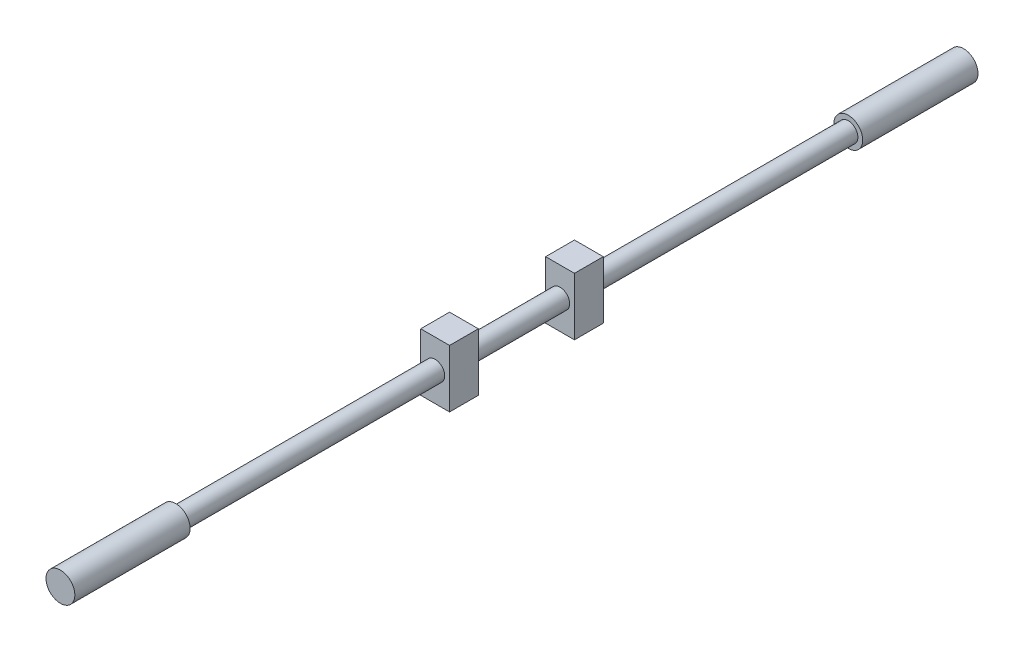
ISO-10303-21;
HEADER;
FILE_DESCRIPTION(('STEP AP214'),'2;1');
FILE_NAME('part.step','',(''),(''),'','','');
FILE_SCHEMA(('AUTOMOTIVE_DESIGN { 1 0 10303 214 1 1 1 1 }'));
ENDSEC;
DATA;
#1=APPLICATION_CONTEXT('core data for automotive mechanical design processes');
#2=APPLICATION_PROTOCOL_DEFINITION('international standard','automotive_design',2000,#1);
#3=PRODUCT_CONTEXT('',#1,'mechanical');
#4=PRODUCT('Part','Part','',(#3));
#5=PRODUCT_RELATED_PRODUCT_CATEGORY('part','',(#4));
#6=PRODUCT_DEFINITION_FORMATION('','',#4);
#7=PRODUCT_DEFINITION_CONTEXT('part definition',#1,'design');
#8=PRODUCT_DEFINITION('design','',#6,#7);
#9=PRODUCT_DEFINITION_SHAPE('','',#8);
#10=(LENGTH_UNIT() NAMED_UNIT(*) SI_UNIT(.MILLI.,.METRE.));
#11=(NAMED_UNIT(*) PLANE_ANGLE_UNIT() SI_UNIT($,.RADIAN.));
#12=(NAMED_UNIT(*) SI_UNIT($,.STERADIAN.) SOLID_ANGLE_UNIT());
#13=UNCERTAINTY_MEASURE_WITH_UNIT(LENGTH_MEASURE(1.E-05),#10,'distance_accuracy_value','');
#14=(GEOMETRIC_REPRESENTATION_CONTEXT(3) GLOBAL_UNCERTAINTY_ASSIGNED_CONTEXT((#13)) GLOBAL_UNIT_ASSIGNED_CONTEXT((#10,
#11,#12)) REPRESENTATION_CONTEXT('',''));
#15=CARTESIAN_POINT('',(0.,0.,0.));
#16=DIRECTION('',(0.,0.,1.));
#17=DIRECTION('',(1.,0.,0.));
#18=AXIS2_PLACEMENT_3D('',#15,#16,#17);
#19=CARTESIAN_POINT('',(0.,0.,1778.));
#20=DIRECTION('',(0.,0.,-1.));
#21=DIRECTION('',(-1.,0.,0.));
#22=AXIS2_PLACEMENT_3D('',#19,#20,#21);
#23=CYLINDRICAL_SURFACE('',#22,25.4);
#24=CARTESIAN_POINT('',(0.,0.,1016.));
#25=DIRECTION('',(0.,0.,1.));
#26=DIRECTION('',(1.,0.,0.));
#27=AXIS2_PLACEMENT_3D('',#24,#25,#26);
#28=CIRCLE('',#27,25.4);
#29=CARTESIAN_POINT('',(-25.4,0.,1016.));
#30=VERTEX_POINT('',#29);
#31=EDGE_CURVE('E186',#30,#30,#28,.T.);
#32=CARTESIAN_POINT('',(0.,0.,762.));
#33=DIRECTION('',(0.,0.,-1.));
#34=DIRECTION('',(-1.,0.,0.));
#35=AXIS2_PLACEMENT_3D('',#32,#33,#34);
#36=CIRCLE('',#35,25.4);
#37=CARTESIAN_POINT('',(-25.4,0.,762.));
#38=VERTEX_POINT('',#37);
#39=EDGE_CURVE('E11',#38,#38,#36,.T.);
#40=CARTESIAN_POINT('',(-25.4,0.,1016.));
#41=CARTESIAN_POINT('',(-25.4,0.,1013.35416666667));
#42=CARTESIAN_POINT('',(-25.4,0.,1010.70833333333));
#43=CARTESIAN_POINT('',(-25.4,0.,1005.41666666667));
#44=CARTESIAN_POINT('',(-25.4,0.,1002.77083333333));
#45=CARTESIAN_POINT('',(-25.4,0.,997.479166666666));
#46=CARTESIAN_POINT('',(-25.4,0.,994.833333333333));
#47=CARTESIAN_POINT('',(-25.4,0.,989.541666666666));
#48=CARTESIAN_POINT('',(-25.4,0.,986.895833333333));
#49=CARTESIAN_POINT('',(-25.4,0.,981.604166666667));
#50=CARTESIAN_POINT('',(-25.4,0.,978.958333333333));
#51=CARTESIAN_POINT('',(-25.4,0.,973.666666666667));
#52=CARTESIAN_POINT('',(-25.4,0.,971.020833333333));
#53=CARTESIAN_POINT('',(-25.4,0.,965.729166666667));
#54=CARTESIAN_POINT('',(-25.4,0.,963.083333333333));
#55=CARTESIAN_POINT('',(-25.4,0.,957.791666666667));
#56=CARTESIAN_POINT('',(-25.4,0.,955.145833333333));
#57=CARTESIAN_POINT('',(-25.4,0.,949.854166666667));
#58=CARTESIAN_POINT('',(-25.4,0.,947.208333333333));
#59=CARTESIAN_POINT('',(-25.4,0.,941.916666666667));
#60=CARTESIAN_POINT('',(-25.4,0.,939.270833333333));
#61=CARTESIAN_POINT('',(-25.4,0.,933.979166666667));
#62=CARTESIAN_POINT('',(-25.4,0.,931.333333333333));
#63=CARTESIAN_POINT('',(-25.4,0.,926.041666666667));
#64=CARTESIAN_POINT('',(-25.4,0.,923.395833333333));
#65=CARTESIAN_POINT('',(-25.4,0.,918.104166666667));
#66=CARTESIAN_POINT('',(-25.4,0.,915.458333333333));
#67=CARTESIAN_POINT('',(-25.4,0.,910.166666666667));
#68=CARTESIAN_POINT('',(-25.4,0.,907.520833333333));
#69=CARTESIAN_POINT('',(-25.4,0.,902.229166666667));
#70=CARTESIAN_POINT('',(-25.4,0.,899.583333333333));
#71=CARTESIAN_POINT('',(-25.4,0.,894.291666666667));
#72=CARTESIAN_POINT('',(-25.4,0.,891.645833333333));
#73=CARTESIAN_POINT('',(-25.4,0.,886.354166666667));
#74=CARTESIAN_POINT('',(-25.4,0.,883.708333333333));
#75=CARTESIAN_POINT('',(-25.4,0.,878.416666666667));
#76=CARTESIAN_POINT('',(-25.4,0.,875.770833333333));
#77=CARTESIAN_POINT('',(-25.4,0.,870.479166666667));
#78=CARTESIAN_POINT('',(-25.4,0.,867.833333333333));
#79=CARTESIAN_POINT('',(-25.4,0.,862.541666666667));
#80=CARTESIAN_POINT('',(-25.4,0.,859.895833333333));
#81=CARTESIAN_POINT('',(-25.4,0.,854.604166666667));
#82=CARTESIAN_POINT('',(-25.4,0.,851.958333333333));
#83=CARTESIAN_POINT('',(-25.4,0.,846.666666666667));
#84=CARTESIAN_POINT('',(-25.4,0.,844.020833333333));
#85=CARTESIAN_POINT('',(-25.4,0.,838.729166666667));
#86=CARTESIAN_POINT('',(-25.4,0.,836.083333333333));
#87=CARTESIAN_POINT('',(-25.4,0.,830.791666666667));
#88=CARTESIAN_POINT('',(-25.4,0.,828.145833333333));
#89=CARTESIAN_POINT('',(-25.4,0.,822.854166666667));
#90=CARTESIAN_POINT('',(-25.4,0.,820.208333333333));
#91=CARTESIAN_POINT('',(-25.4,0.,814.916666666667));
#92=CARTESIAN_POINT('',(-25.4,0.,812.270833333333));
#93=CARTESIAN_POINT('',(-25.4,0.,806.979166666667));
#94=CARTESIAN_POINT('',(-25.4,0.,804.333333333333));
#95=CARTESIAN_POINT('',(-25.4,0.,799.041666666667));
#96=CARTESIAN_POINT('',(-25.4,0.,796.395833333333));
#97=CARTESIAN_POINT('',(-25.4,0.,791.104166666667));
#98=CARTESIAN_POINT('',(-25.4,0.,788.458333333333));
#99=CARTESIAN_POINT('',(-25.4,0.,783.166666666667));
#100=CARTESIAN_POINT('',(-25.4,0.,780.520833333333));
#101=CARTESIAN_POINT('',(-25.4,0.,775.229166666667));
#102=CARTESIAN_POINT('',(-25.4,0.,772.583333333333));
#103=CARTESIAN_POINT('',(-25.4,0.,767.291666666667));
#104=CARTESIAN_POINT('',(-25.4,0.,764.645833333333));
#105=CARTESIAN_POINT('',(-25.4,0.,762.));
#106=B_SPLINE_CURVE_WITH_KNOTS('',3,(#40,#41,#42,#43,#44,#45,#46,#47,#48,#49,#50,#51,#52,#53,
#54,#55,#56,#57,#58,#59,#60,#61,#62,#63,#64,#65,#66,#67,#68,#69,#70,#71,#72,#73,#74,#75,#76,#77,
#78,#79,#80,#81,#82,#83,#84,#85,#86,#87,#88,#89,#90,#91,#92,#93,#94,#95,#96,#97,#98,#99,#100,
#101,#102,#103,#104,#105),.UNSPECIFIED.,.F.,.F.,(4,2,2,2,2,2,2,2,2,2,2,2,2,2,2,2,2,2,2,2,2,2,2,
2,2,2,2,2,2,2,2,2,4),(0.,7.93749999999993,15.8750000000001,23.8125,31.7499999999999,39.6875,
47.6249999999999,55.5625,63.4999999999999,71.4374999999999,79.375,87.3124999999999,
95.2499999999999,103.1875,111.125,119.0625,127.,134.9375,142.875,150.8125,158.75,166.6875,
174.625,182.5625,190.5,198.4375,206.375,214.3125,222.25,230.1875,238.125,246.0625,254.),.UNSPECIFIED.);
#107=EDGE_CURVE('BSEAM37',#30,#38,#106,.T.);
#108=ORIENTED_EDGE('',*,*,#31,.F.);
#109=ORIENTED_EDGE('',*,*,#39,.F.);
#110=ORIENTED_EDGE('',*,*,#107,.T.);
#111=ORIENTED_EDGE('',*,*,#107,.F.);
#112=EDGE_LOOP('',(#108,#110,#109,#111));
#113=FACE_BOUND('',#112,.T.);
#114=ADVANCED_FACE('F37',(#113),#23,.T.);
#115=CARTESIAN_POINT('',(0.,0.,1778.));
#116=DIRECTION('',(0.,0.,1.));
#117=DIRECTION('',(1.,0.,0.));
#118=AXIS2_PLACEMENT_3D('',#115,#116,#117);
#119=CIRCLE('',#118,25.4);
#120=CARTESIAN_POINT('',(25.4,0.,1778.));
#121=VERTEX_POINT('',#120);
#122=EDGE_CURVE('E180',#121,#121,#119,.T.);
#123=ORIENTED_EDGE('',*,*,#122,.F.);
#124=EDGE_LOOP('',(#123));
#125=FACE_BOUND('',#124,.T.);
#126=CARTESIAN_POINT('',(0.,0.,1092.2));
#127=DIRECTION('',(0.,0.,-1.));
#128=DIRECTION('',(-1.,0.,0.));
#129=AXIS2_PLACEMENT_3D('',#126,#127,#128);
#130=CIRCLE('',#129,25.4);
#131=CARTESIAN_POINT('',(-25.4,0.,1092.2));
#132=VERTEX_POINT('',#131);
#133=EDGE_CURVE('E191',#132,#132,#130,.T.);
#134=ORIENTED_EDGE('',*,*,#133,.F.);
#135=EDGE_LOOP('',(#134));
#136=FACE_BOUND('',#135,.T.);
#137=ADVANCED_FACE('F39',(#125,#136),#23,.T.);
#138=CARTESIAN_POINT('',(0.,0.,2082.8));
#139=DIRECTION('',(0.,0.,-1.));
#140=DIRECTION('',(-1.,0.,0.));
#141=AXIS2_PLACEMENT_3D('',#138,#139,#140);
#142=CYLINDRICAL_SURFACE('',#141,38.1);
#143=CARTESIAN_POINT('',(0.,0.,2082.8));
#144=DIRECTION('',(0.,0.,1.));
#145=DIRECTION('',(1.,0.,0.));
#146=AXIS2_PLACEMENT_3D('',#143,#144,#145);
#147=CIRCLE('',#146,38.1);
#148=CARTESIAN_POINT('',(-38.1,0.,2082.8));
#149=VERTEX_POINT('',#148);
#150=EDGE_CURVE('E177',#149,#149,#147,.T.);
#151=CARTESIAN_POINT('',(0.,0.,1778.));
#152=DIRECTION('',(0.,0.,1.));
#153=DIRECTION('',(1.,0.,0.));
#154=AXIS2_PLACEMENT_3D('',#151,#152,#153);
#155=CIRCLE('',#154,38.1);
#156=CARTESIAN_POINT('',(-38.1,0.,1778.));
#157=VERTEX_POINT('',#156);
#158=EDGE_CURVE('E181',#157,#157,#155,.T.);
#159=CARTESIAN_POINT('',(-38.1,0.,2082.8));
#160=CARTESIAN_POINT('',(-38.1,0.,2079.625));
#161=CARTESIAN_POINT('',(-38.1,0.,2076.45));
#162=CARTESIAN_POINT('',(-38.1,0.,2070.1));
#163=CARTESIAN_POINT('',(-38.1,0.,2066.925));
#164=CARTESIAN_POINT('',(-38.1,0.,2060.575));
#165=CARTESIAN_POINT('',(-38.1,0.,2057.4));
#166=CARTESIAN_POINT('',(-38.1,0.,2051.05));
#167=CARTESIAN_POINT('',(-38.1,0.,2047.875));
#168=CARTESIAN_POINT('',(-38.1,0.,2041.525));
#169=CARTESIAN_POINT('',(-38.1,0.,2038.35));
#170=CARTESIAN_POINT('',(-38.1,0.,2032.));
#171=CARTESIAN_POINT('',(-38.1,0.,2028.825));
#172=CARTESIAN_POINT('',(-38.1,0.,2022.475));
#173=CARTESIAN_POINT('',(-38.1,0.,2019.3));
#174=CARTESIAN_POINT('',(-38.1,0.,2012.95));
#175=CARTESIAN_POINT('',(-38.1,0.,2009.775));
#176=CARTESIAN_POINT('',(-38.1,0.,2003.425));
#177=CARTESIAN_POINT('',(-38.1,0.,2000.25));
#178=CARTESIAN_POINT('',(-38.1,0.,1993.9));
#179=CARTESIAN_POINT('',(-38.1,0.,1990.725));
#180=CARTESIAN_POINT('',(-38.1,0.,1984.375));
#181=CARTESIAN_POINT('',(-38.1,0.,1981.2));
#182=CARTESIAN_POINT('',(-38.1,0.,1974.85));
#183=CARTESIAN_POINT('',(-38.1,0.,1971.675));
#184=CARTESIAN_POINT('',(-38.1,0.,1965.325));
#185=CARTESIAN_POINT('',(-38.1,0.,1962.15));
#186=CARTESIAN_POINT('',(-38.1,0.,1955.8));
#187=CARTESIAN_POINT('',(-38.1,0.,1952.625));
#188=CARTESIAN_POINT('',(-38.1,0.,1946.275));
#189=CARTESIAN_POINT('',(-38.1,0.,1943.1));
#190=CARTESIAN_POINT('',(-38.1,0.,1936.75));
#191=CARTESIAN_POINT('',(-38.1,0.,1933.575));
#192=CARTESIAN_POINT('',(-38.1,0.,1927.225));
#193=CARTESIAN_POINT('',(-38.1,0.,1924.05));
#194=CARTESIAN_POINT('',(-38.1,0.,1917.7));
#195=CARTESIAN_POINT('',(-38.1,0.,1914.525));
#196=CARTESIAN_POINT('',(-38.1,0.,1908.175));
#197=CARTESIAN_POINT('',(-38.1,0.,1905.));
#198=CARTESIAN_POINT('',(-38.1,0.,1898.65));
#199=CARTESIAN_POINT('',(-38.1,0.,1895.475));
#200=CARTESIAN_POINT('',(-38.1,0.,1889.125));
#201=CARTESIAN_POINT('',(-38.1,0.,1885.95));
#202=CARTESIAN_POINT('',(-38.1,0.,1879.6));
#203=CARTESIAN_POINT('',(-38.1,0.,1876.425));
#204=CARTESIAN_POINT('',(-38.1,0.,1870.075));
#205=CARTESIAN_POINT('',(-38.1,0.,1866.9));
#206=CARTESIAN_POINT('',(-38.1,0.,1860.55));
#207=CARTESIAN_POINT('',(-38.1,0.,1857.375));
#208=CARTESIAN_POINT('',(-38.1,0.,1851.025));
#209=CARTESIAN_POINT('',(-38.1,0.,1847.85));
#210=CARTESIAN_POINT('',(-38.1,0.,1841.5));
#211=CARTESIAN_POINT('',(-38.1,0.,1838.325));
#212=CARTESIAN_POINT('',(-38.1,0.,1831.975));
#213=CARTESIAN_POINT('',(-38.1,0.,1828.8));
#214=CARTESIAN_POINT('',(-38.1,0.,1822.45));
#215=CARTESIAN_POINT('',(-38.1,0.,1819.275));
#216=CARTESIAN_POINT('',(-38.1,0.,1812.925));
#217=CARTESIAN_POINT('',(-38.1,0.,1809.75));
#218=CARTESIAN_POINT('',(-38.1,0.,1803.4));
#219=CARTESIAN_POINT('',(-38.1,0.,1800.225));
#220=CARTESIAN_POINT('',(-38.1,0.,1793.875));
#221=CARTESIAN_POINT('',(-38.1,0.,1790.7));
#222=CARTESIAN_POINT('',(-38.1,0.,1784.35));
#223=CARTESIAN_POINT('',(-38.1,0.,1781.175));
#224=CARTESIAN_POINT('',(-38.1,0.,1778.));
#225=B_SPLINE_CURVE_WITH_KNOTS('',3,(#159,#160,#161,#162,#163,#164,#165,#166,#167,#168,#169,
#170,#171,#172,#173,#174,#175,#176,#177,#178,#179,#180,#181,#182,#183,#184,#185,#186,#187,#188,
#189,#190,#191,#192,#193,#194,#195,#196,#197,#198,#199,#200,#201,#202,#203,#204,#205,#206,#207,
#208,#209,#210,#211,#212,#213,#214,#215,#216,#217,#218,#219,#220,#221,#222,#223,#224),
.UNSPECIFIED.,.F.,.F.,(4,2,2,2,2,2,2,2,2,2,2,2,2,2,2,2,2,2,2,2,2,2,2,2,2,2,2,2,2,2,2,2,4),(0.,
9.52500000000001,19.05,28.575,38.1,47.625,57.15,66.675,76.2,85.7250000000003,95.2500000000003,
104.775,114.3,123.825,133.35,142.875,152.4,161.925,171.45,180.975,190.5,200.025,209.55,219.075,
228.6,238.125,247.65,257.175,266.7,276.225,285.75,295.275,304.8),.UNSPECIFIED.);
#226=EDGE_CURVE('BSEAM208',#149,#157,#225,.T.);
#227=ORIENTED_EDGE('',*,*,#150,.F.);
#228=ORIENTED_EDGE('',*,*,#158,.T.);
#229=ORIENTED_EDGE('',*,*,#226,.T.);
#230=ORIENTED_EDGE('',*,*,#226,.F.);
#231=EDGE_LOOP('',(#227,#229,#228,#230));
#232=FACE_BOUND('',#231,.T.);
#233=ADVANCED_FACE('F208',(#232),#142,.T.);
#234=CARTESIAN_POINT('',(0.,0.,2082.8));
#235=DIRECTION('',(0.,0.,1.));
#236=DIRECTION('',(1.,0.,0.));
#237=AXIS2_PLACEMENT_3D('',#234,#235,#236);
#238=PLANE('',#237);
#239=ORIENTED_EDGE('',*,*,#150,.T.);
#240=EDGE_LOOP('',(#239));
#241=FACE_BOUND('',#240,.T.);
#242=ADVANCED_FACE('F273',(#241),#238,.T.);
#243=CARTESIAN_POINT('',(0.,0.,1778.));
#244=DIRECTION('',(0.,0.,1.));
#245=DIRECTION('',(1.,0.,0.));
#246=AXIS2_PLACEMENT_3D('',#243,#244,#245);
#247=PLANE('',#246);
#248=ORIENTED_EDGE('',*,*,#122,.T.);
#249=EDGE_LOOP('',(#248));
#250=FACE_BOUND('',#249,.T.);
#251=ORIENTED_EDGE('',*,*,#158,.F.);
#252=EDGE_LOOP('',(#251));
#253=FACE_BOUND('',#252,.T.);
#254=ADVANCED_FACE('F265',(#250,#253),#247,.F.);
#255=CARTESIAN_POINT('',(-38.1,76.2,1016.));
#256=DIRECTION('',(1.,0.,0.));
#257=DIRECTION('',(0.,0.,-1.));
#258=AXIS2_PLACEMENT_3D('',#255,#256,#257);
#259=PLANE('',#258);
#260=DIRECTION('',(0.,0.,1.));
#261=VECTOR('',#260,1.);
#262=CARTESIAN_POINT('',(-38.1,-76.2,1016.));
#263=LINE('',#262,#261);
#264=CARTESIAN_POINT('',(-38.1,-76.2,1016.));
#265=VERTEX_POINT('',#264);
#266=CARTESIAN_POINT('',(-38.1,-76.2,1092.2));
#267=VERTEX_POINT('',#266);
#268=EDGE_CURVE('E139',#265,#267,#263,.T.);
#269=ORIENTED_EDGE('',*,*,#268,.T.);
#270=DIRECTION('',(0.,-1.,0.));
#271=VECTOR('',#270,1.);
#272=CARTESIAN_POINT('',(-38.1,76.2,1092.2));
#273=LINE('',#272,#271);
#274=CARTESIAN_POINT('',(-38.1,76.2,1092.2));
#275=VERTEX_POINT('',#274);
#276=EDGE_CURVE('E168',#275,#267,#273,.T.);
#277=ORIENTED_EDGE('',*,*,#276,.F.);
#278=DIRECTION('',(0.,0.,1.));
#279=VECTOR('',#278,1.);
#280=CARTESIAN_POINT('',(-38.1,76.2,1016.));
#281=LINE('',#280,#279);
#282=CARTESIAN_POINT('',(-38.1,76.2,1016.));
#283=VERTEX_POINT('',#282);
#284=EDGE_CURVE('E153',#283,#275,#281,.T.);
#285=ORIENTED_EDGE('',*,*,#284,.F.);
#286=DIRECTION('',(0.,-1.,0.));
#287=VECTOR('',#286,1.);
#288=CARTESIAN_POINT('',(-38.1,76.2,1016.));
#289=LINE('',#288,#287);
#290=EDGE_CURVE('E158',#283,#265,#289,.T.);
#291=ORIENTED_EDGE('',*,*,#290,.T.);
#292=EDGE_LOOP('',(#269,#277,#285,#291));
#293=FACE_BOUND('',#292,.T.);
#294=ADVANCED_FACE('F261',(#293),#259,.F.);
#295=CARTESIAN_POINT('',(-38.1,76.2,1092.2));
#296=DIRECTION('',(0.,0.,-1.));
#297=DIRECTION('',(-1.,0.,0.));
#298=AXIS2_PLACEMENT_3D('',#295,#296,#297);
#299=PLANE('',#298);
#300=ORIENTED_EDGE('',*,*,#133,.T.);
#301=EDGE_LOOP('',(#300));
#302=FACE_BOUND('',#301,.T.);
#303=DIRECTION('',(1.,0.,0.));
#304=VECTOR('',#303,1.);
#305=CARTESIAN_POINT('',(-38.1,-76.2,1092.2));
#306=LINE('',#305,#304);
#307=CARTESIAN_POINT('',(38.1000000000001,-76.2,1092.2));
#308=VERTEX_POINT('',#307);
#309=EDGE_CURVE('E142',#267,#308,#306,.T.);
#310=ORIENTED_EDGE('',*,*,#309,.T.);
#311=DIRECTION('',(0.,-1.,0.));
#312=VECTOR('',#311,1.);
#313=CARTESIAN_POINT('',(38.1000000000001,76.2,1092.2));
#314=LINE('',#313,#312);
#315=CARTESIAN_POINT('',(38.1000000000001,76.2,1092.2));
#316=VERTEX_POINT('',#315);
#317=EDGE_CURVE('E166',#316,#308,#314,.T.);
#318=ORIENTED_EDGE('',*,*,#317,.F.);
#319=DIRECTION('',(1.,0.,0.));
#320=VECTOR('',#319,1.);
#321=CARTESIAN_POINT('',(-38.1,76.2,1092.2));
#322=LINE('',#321,#320);
#323=EDGE_CURVE('E86',#275,#316,#322,.T.);
#324=ORIENTED_EDGE('',*,*,#323,.F.);
#325=ORIENTED_EDGE('',*,*,#276,.T.);
#326=EDGE_LOOP('',(#310,#318,#324,#325));
#327=FACE_BOUND('',#326,.T.);
#328=ADVANCED_FACE('F258',(#302,#327),#299,.F.);
#329=CARTESIAN_POINT('',(38.1000000000001,76.2,1016.));
#330=DIRECTION('',(-1.,0.,0.));
#331=DIRECTION('',(0.,0.,1.));
#332=AXIS2_PLACEMENT_3D('',#329,#330,#331);
#333=PLANE('',#332);
#334=DIRECTION('',(0.,0.,-1.));
#335=VECTOR('',#334,1.);
#336=CARTESIAN_POINT('',(38.1000000000001,-76.2,1016.));
#337=LINE('',#336,#335);
#338=CARTESIAN_POINT('',(38.1000000000001,-76.2,1016.));
#339=VERTEX_POINT('',#338);
#340=EDGE_CURVE('E72',#308,#339,#337,.T.);
#341=ORIENTED_EDGE('',*,*,#340,.T.);
#342=DIRECTION('',(0.,-1.,0.));
#343=VECTOR('',#342,1.);
#344=CARTESIAN_POINT('',(38.1000000000001,76.2,1016.));
#345=LINE('',#344,#343);
#346=CARTESIAN_POINT('',(38.1000000000001,76.2,1016.));
#347=VERTEX_POINT('',#346);
#348=EDGE_CURVE('E164',#347,#339,#345,.T.);
#349=ORIENTED_EDGE('',*,*,#348,.F.);
#350=DIRECTION('',(0.,0.,-1.));
#351=VECTOR('',#350,1.);
#352=CARTESIAN_POINT('',(38.1000000000001,76.2,1016.));
#353=LINE('',#352,#351);
#354=EDGE_CURVE('E156',#316,#347,#353,.T.);
#355=ORIENTED_EDGE('',*,*,#354,.F.);
#356=ORIENTED_EDGE('',*,*,#317,.T.);
#357=EDGE_LOOP('',(#341,#349,#355,#356));
#358=FACE_BOUND('',#357,.T.);
#359=ADVANCED_FACE('F254',(#358),#333,.F.);
#360=CARTESIAN_POINT('',(-38.1,76.2,1016.));
#361=DIRECTION('',(0.,0.,1.));
#362=DIRECTION('',(1.,0.,0.));
#363=AXIS2_PLACEMENT_3D('',#360,#361,#362);
#364=PLANE('',#363);
#365=ORIENTED_EDGE('',*,*,#31,.T.);
#366=EDGE_LOOP('',(#365));
#367=FACE_BOUND('',#366,.T.);
#368=DIRECTION('',(-1.,0.,0.));
#369=VECTOR('',#368,1.);
#370=CARTESIAN_POINT('',(-38.1,-76.2,1016.));
#371=LINE('',#370,#369);
#372=EDGE_CURVE('E78',#339,#265,#371,.T.);
#373=ORIENTED_EDGE('',*,*,#372,.T.);
#374=ORIENTED_EDGE('',*,*,#290,.F.);
#375=DIRECTION('',(-1.,0.,0.));
#376=VECTOR('',#375,1.);
#377=CARTESIAN_POINT('',(-38.1,76.2,1016.));
#378=LINE('',#377,#376);
#379=EDGE_CURVE('E54',#347,#283,#378,.T.);
#380=ORIENTED_EDGE('',*,*,#379,.F.);
#381=ORIENTED_EDGE('',*,*,#348,.T.);
#382=EDGE_LOOP('',(#373,#374,#380,#381));
#383=FACE_BOUND('',#382,.T.);
#384=ADVANCED_FACE('F248',(#367,#383),#364,.F.);
#385=CARTESIAN_POINT('',(0.,76.2,0.));
#386=DIRECTION('',(0.,1.,0.));
#387=DIRECTION('',(0.,0.,1.));
#388=AXIS2_PLACEMENT_3D('',#385,#386,#387);
#389=PLANE('',#388);
#390=ORIENTED_EDGE('',*,*,#284,.T.);
#391=ORIENTED_EDGE('',*,*,#323,.T.);
#392=ORIENTED_EDGE('',*,*,#354,.T.);
#393=ORIENTED_EDGE('',*,*,#379,.T.);
#394=EDGE_LOOP('',(#390,#391,#392,#393));
#395=FACE_BOUND('',#394,.T.);
#396=ADVANCED_FACE('F244',(#395),#389,.T.);
#397=CARTESIAN_POINT('',(0.,-76.2,0.));
#398=DIRECTION('',(0.,1.,0.));
#399=DIRECTION('',(0.,0.,1.));
#400=AXIS2_PLACEMENT_3D('',#397,#398,#399);
#401=PLANE('',#400);
#402=ORIENTED_EDGE('',*,*,#268,.F.);
#403=ORIENTED_EDGE('',*,*,#372,.F.);
#404=ORIENTED_EDGE('',*,*,#340,.F.);
#405=ORIENTED_EDGE('',*,*,#309,.F.);
#406=EDGE_LOOP('',(#402,#403,#404,#405));
#407=FACE_BOUND('',#406,.T.);
#408=ADVANCED_FACE('F247',(#407),#401,.F.);
#409=CARTESIAN_POINT('',(-38.1,76.2,685.8));
#410=DIRECTION('',(1.,0.,0.));
#411=DIRECTION('',(0.,0.,-1.));
#412=AXIS2_PLACEMENT_3D('',#409,#410,#411);
#413=PLANE('',#412);
#414=DIRECTION('',(0.,0.,1.));
#415=VECTOR('',#414,1.);
#416=CARTESIAN_POINT('',(-38.1,-76.2,685.8));
#417=LINE('',#416,#415);
#418=CARTESIAN_POINT('',(-38.1,-76.2,685.8));
#419=VERTEX_POINT('',#418);
#420=CARTESIAN_POINT('',(-38.1,-76.2,762.));
#421=VERTEX_POINT('',#420);
#422=EDGE_CURVE('E132',#419,#421,#417,.T.);
#423=ORIENTED_EDGE('',*,*,#422,.T.);
#424=DIRECTION('',(0.,-1.,0.));
#425=VECTOR('',#424,1.);
#426=CARTESIAN_POINT('',(-38.1,76.2,762.));
#427=LINE('',#426,#425);
#428=CARTESIAN_POINT('',(-38.1,76.2,762.));
#429=VERTEX_POINT('',#428);
#430=EDGE_CURVE('E227',#429,#421,#427,.T.);
#431=ORIENTED_EDGE('',*,*,#430,.F.);
#432=DIRECTION('',(0.,0.,1.));
#433=VECTOR('',#432,1.);
#434=CARTESIAN_POINT('',(-38.1,76.2,685.8));
#435=LINE('',#434,#433);
#436=CARTESIAN_POINT('',(-38.1,76.2,685.8));
#437=VERTEX_POINT('',#436);
#438=EDGE_CURVE('E126',#437,#429,#435,.T.);
#439=ORIENTED_EDGE('',*,*,#438,.F.);
#440=DIRECTION('',(0.,-1.,0.));
#441=VECTOR('',#440,1.);
#442=CARTESIAN_POINT('',(-38.1,76.2,685.8));
#443=LINE('',#442,#441);
#444=EDGE_CURVE('E118',#437,#419,#443,.T.);
#445=ORIENTED_EDGE('',*,*,#444,.T.);
#446=EDGE_LOOP('',(#423,#431,#439,#445));
#447=FACE_BOUND('',#446,.T.);
#448=ADVANCED_FACE('F130',(#447),#413,.F.);
#449=CARTESIAN_POINT('',(-38.1,76.2,762.));
#450=DIRECTION('',(0.,0.,-1.));
#451=DIRECTION('',(-1.,0.,0.));
#452=AXIS2_PLACEMENT_3D('',#449,#450,#451);
#453=PLANE('',#452);
#454=ORIENTED_EDGE('',*,*,#39,.T.);
#455=EDGE_LOOP('',(#454));
#456=FACE_BOUND('',#455,.T.);
#457=DIRECTION('',(1.,0.,0.));
#458=VECTOR('',#457,1.);
#459=CARTESIAN_POINT('',(-38.1,-76.2,762.));
#460=LINE('',#459,#458);
#461=CARTESIAN_POINT('',(38.1,-76.2,762.));
#462=VERTEX_POINT('',#461);
#463=EDGE_CURVE('E137',#421,#462,#460,.T.);
#464=ORIENTED_EDGE('',*,*,#463,.T.);
#465=DIRECTION('',(0.,-1.,0.));
#466=VECTOR('',#465,1.);
#467=CARTESIAN_POINT('',(38.1,76.2,762.));
#468=LINE('',#467,#466);
#469=CARTESIAN_POINT('',(38.1,76.2,762.));
#470=VERTEX_POINT('',#469);
#471=EDGE_CURVE('E225',#470,#462,#468,.T.);
#472=ORIENTED_EDGE('',*,*,#471,.F.);
#473=DIRECTION('',(1.,0.,0.));
#474=VECTOR('',#473,1.);
#475=CARTESIAN_POINT('',(-38.1,76.2,762.));
#476=LINE('',#475,#474);
#477=EDGE_CURVE('E150',#429,#470,#476,.T.);
#478=ORIENTED_EDGE('',*,*,#477,.F.);
#479=ORIENTED_EDGE('',*,*,#430,.T.);
#480=EDGE_LOOP('',(#464,#472,#478,#479));
#481=FACE_BOUND('',#480,.T.);
#482=ADVANCED_FACE('F218',(#456,#481),#453,.F.);
#483=CARTESIAN_POINT('',(38.1,76.2,685.8));
#484=DIRECTION('',(-1.,0.,0.));
#485=DIRECTION('',(0.,0.,1.));
#486=AXIS2_PLACEMENT_3D('',#483,#484,#485);
#487=PLANE('',#486);
#488=DIRECTION('',(0.,0.,-1.));
#489=VECTOR('',#488,1.);
#490=CARTESIAN_POINT('',(38.1,-76.2,685.8));
#491=LINE('',#490,#489);
#492=CARTESIAN_POINT('',(38.1,-76.2,685.8));
#493=VERTEX_POINT('',#492);
#494=EDGE_CURVE('E125',#462,#493,#491,.T.);
#495=ORIENTED_EDGE('',*,*,#494,.T.);
#496=DIRECTION('',(0.,-1.,0.));
#497=VECTOR('',#496,1.);
#498=CARTESIAN_POINT('',(38.1,76.2,685.8));
#499=LINE('',#498,#497);
#500=CARTESIAN_POINT('',(38.1,76.2,685.8));
#501=VERTEX_POINT('',#500);
#502=EDGE_CURVE('E121',#501,#493,#499,.T.);
#503=ORIENTED_EDGE('',*,*,#502,.F.);
#504=DIRECTION('',(0.,0.,-1.));
#505=VECTOR('',#504,1.);
#506=CARTESIAN_POINT('',(38.1,76.2,685.8));
#507=LINE('',#506,#505);
#508=EDGE_CURVE('E148',#470,#501,#507,.T.);
#509=ORIENTED_EDGE('',*,*,#508,.F.);
#510=ORIENTED_EDGE('',*,*,#471,.T.);
#511=EDGE_LOOP('',(#495,#503,#509,#510));
#512=FACE_BOUND('',#511,.T.);
#513=ADVANCED_FACE('F221',(#512),#487,.F.);
#514=CARTESIAN_POINT('',(-38.1,76.2,685.8));
#515=DIRECTION('',(0.,0.,1.));
#516=DIRECTION('',(1.,0.,0.));
#517=AXIS2_PLACEMENT_3D('',#514,#515,#516);
#518=PLANE('',#517);
#519=CARTESIAN_POINT('',(0.,0.,685.8));
#520=DIRECTION('',(0.,0.,1.));
#521=DIRECTION('',(1.,0.,0.));
#522=AXIS2_PLACEMENT_3D('',#519,#520,#521);
#523=CIRCLE('',#522,25.4);
#524=CARTESIAN_POINT('',(25.4,0.,685.8));
#525=VERTEX_POINT('',#524);
#526=EDGE_CURVE('E46',#525,#525,#523,.T.);
#527=ORIENTED_EDGE('',*,*,#526,.T.);
#528=EDGE_LOOP('',(#527));
#529=FACE_BOUND('',#528,.T.);
#530=DIRECTION('',(-1.,0.,0.));
#531=VECTOR('',#530,1.);
#532=CARTESIAN_POINT('',(-38.1,-76.2,685.8));
#533=LINE('',#532,#531);
#534=EDGE_CURVE('E114',#493,#419,#533,.T.);
#535=ORIENTED_EDGE('',*,*,#534,.T.);
#536=ORIENTED_EDGE('',*,*,#444,.F.);
#537=DIRECTION('',(-1.,0.,0.));
#538=VECTOR('',#537,1.);
#539=CARTESIAN_POINT('',(-38.1,76.2,685.8));
#540=LINE('',#539,#538);
#541=EDGE_CURVE('E134',#501,#437,#540,.T.);
#542=ORIENTED_EDGE('',*,*,#541,.F.);
#543=ORIENTED_EDGE('',*,*,#502,.T.);
#544=EDGE_LOOP('',(#535,#536,#542,#543));
#545=FACE_BOUND('',#544,.T.);
#546=ADVANCED_FACE('F116',(#529,#545),#518,.F.);
#547=CARTESIAN_POINT('',(0.,76.2,0.));
#548=DIRECTION('',(0.,1.,0.));
#549=DIRECTION('',(0.,0.,1.));
#550=AXIS2_PLACEMENT_3D('',#547,#548,#549);
#551=PLANE('',#550);
#552=ORIENTED_EDGE('',*,*,#438,.T.);
#553=ORIENTED_EDGE('',*,*,#477,.T.);
#554=ORIENTED_EDGE('',*,*,#508,.T.);
#555=ORIENTED_EDGE('',*,*,#541,.T.);
#556=EDGE_LOOP('',(#552,#553,#554,#555));
#557=FACE_BOUND('',#556,.T.);
#558=ADVANCED_FACE('F233',(#557),#551,.T.);
#559=CARTESIAN_POINT('',(0.,-76.2,0.));
#560=DIRECTION('',(0.,1.,0.));
#561=DIRECTION('',(0.,0.,1.));
#562=AXIS2_PLACEMENT_3D('',#559,#560,#561);
#563=PLANE('',#562);
#564=ORIENTED_EDGE('',*,*,#422,.F.);
#565=ORIENTED_EDGE('',*,*,#534,.F.);
#566=ORIENTED_EDGE('',*,*,#494,.F.);
#567=ORIENTED_EDGE('',*,*,#463,.F.);
#568=EDGE_LOOP('',(#564,#565,#566,#567));
#569=FACE_BOUND('',#568,.T.);
#570=ADVANCED_FACE('F136',(#569),#563,.F.);
#571=CARTESIAN_POINT('',(0.,0.,-304.8));
#572=DIRECTION('',(0.,0.,-1.));
#573=DIRECTION('',(-1.,0.,0.));
#574=AXIS2_PLACEMENT_3D('',#571,#572,#573);
#575=PLANE('',#574);
#576=CARTESIAN_POINT('',(0.,0.,-304.8));
#577=DIRECTION('',(0.,0.,-1.));
#578=DIRECTION('',(-1.,0.,0.));
#579=AXIS2_PLACEMENT_3D('',#576,#577,#578);
#580=CIRCLE('',#579,38.1);
#581=CARTESIAN_POINT('',(38.1,0.,-304.8));
#582=VERTEX_POINT('',#581);
#583=EDGE_CURVE('E171',#582,#582,#580,.T.);
#584=ORIENTED_EDGE('',*,*,#583,.T.);
#585=EDGE_LOOP('',(#584));
#586=FACE_BOUND('',#585,.T.);
#587=ADVANCED_FACE('F240',(#586),#575,.T.);
#588=CARTESIAN_POINT('',(0.,0.,-304.8));
#589=DIRECTION('',(0.,0.,1.));
#590=DIRECTION('',(1.,0.,0.));
#591=AXIS2_PLACEMENT_3D('',#588,#589,#590);
#592=CYLINDRICAL_SURFACE('',#591,38.1);
#593=CARTESIAN_POINT('',(0.,0.,0.));
#594=DIRECTION('',(0.,0.,-1.));
#595=DIRECTION('',(-1.,0.,0.));
#596=AXIS2_PLACEMENT_3D('',#593,#594,#595);
#597=CIRCLE('',#596,38.1);
#598=CARTESIAN_POINT('',(38.1,0.,0.));
#599=VERTEX_POINT('',#598);
#600=EDGE_CURVE('E170',#599,#599,#597,.T.);
#601=CARTESIAN_POINT('',(38.1,0.,-304.8));
#602=CARTESIAN_POINT('',(38.1,0.,-301.625));
#603=CARTESIAN_POINT('',(38.1,0.,-298.45));
#604=CARTESIAN_POINT('',(38.1,0.,-292.1));
#605=CARTESIAN_POINT('',(38.1,0.,-288.925));
#606=CARTESIAN_POINT('',(38.1,0.,-282.575));
#607=CARTESIAN_POINT('',(38.1,0.,-279.4));
#608=CARTESIAN_POINT('',(38.1,0.,-273.05));
#609=CARTESIAN_POINT('',(38.1,0.,-269.875));
#610=CARTESIAN_POINT('',(38.1,0.,-263.525));
#611=CARTESIAN_POINT('',(38.1,0.,-260.35));
#612=CARTESIAN_POINT('',(38.1,0.,-254.));
#613=CARTESIAN_POINT('',(38.1,0.,-250.825));
#614=CARTESIAN_POINT('',(38.1,0.,-244.475));
#615=CARTESIAN_POINT('',(38.1,0.,-241.3));
#616=CARTESIAN_POINT('',(38.1,0.,-234.95));
#617=CARTESIAN_POINT('',(38.1,0.,-231.775));
#618=CARTESIAN_POINT('',(38.1,0.,-225.425));
#619=CARTESIAN_POINT('',(38.1,0.,-222.25));
#620=CARTESIAN_POINT('',(38.1,0.,-215.9));
#621=CARTESIAN_POINT('',(38.1,0.,-212.725));
#622=CARTESIAN_POINT('',(38.1,0.,-206.375));
#623=CARTESIAN_POINT('',(38.1,0.,-203.2));
#624=CARTESIAN_POINT('',(38.1,0.,-196.85));
#625=CARTESIAN_POINT('',(38.1,0.,-193.675));
#626=CARTESIAN_POINT('',(38.1,0.,-187.325));
#627=CARTESIAN_POINT('',(38.1,0.,-184.15));
#628=CARTESIAN_POINT('',(38.1,0.,-177.8));
#629=CARTESIAN_POINT('',(38.1,0.,-174.625));
#630=CARTESIAN_POINT('',(38.1,0.,-168.275));
#631=CARTESIAN_POINT('',(38.1,0.,-165.1));
#632=CARTESIAN_POINT('',(38.1,0.,-158.75));
#633=CARTESIAN_POINT('',(38.1,0.,-155.575));
#634=CARTESIAN_POINT('',(38.1,0.,-149.225));
#635=CARTESIAN_POINT('',(38.1,0.,-146.05));
#636=CARTESIAN_POINT('',(38.1,0.,-139.7));
#637=CARTESIAN_POINT('',(38.1,0.,-136.525));
#638=CARTESIAN_POINT('',(38.1,0.,-130.175));
#639=CARTESIAN_POINT('',(38.1,0.,-127.));
#640=CARTESIAN_POINT('',(38.1,0.,-120.65));
#641=CARTESIAN_POINT('',(38.1,0.,-117.475));
#642=CARTESIAN_POINT('',(38.1,0.,-111.125));
#643=CARTESIAN_POINT('',(38.1,0.,-107.95));
#644=CARTESIAN_POINT('',(38.1,0.,-101.6));
#645=CARTESIAN_POINT('',(38.1,0.,-98.425));
#646=CARTESIAN_POINT('',(38.1,0.,-92.075));
#647=CARTESIAN_POINT('',(38.1,0.,-88.9));
#648=CARTESIAN_POINT('',(38.1,0.,-82.55));
#649=CARTESIAN_POINT('',(38.1,0.,-79.375));
#650=CARTESIAN_POINT('',(38.1,0.,-73.025));
#651=CARTESIAN_POINT('',(38.1,0.,-69.85));
#652=CARTESIAN_POINT('',(38.1,0.,-63.5));
#653=CARTESIAN_POINT('',(38.1,0.,-60.325));
#654=CARTESIAN_POINT('',(38.1,0.,-53.975));
#655=CARTESIAN_POINT('',(38.1,0.,-50.8));
#656=CARTESIAN_POINT('',(38.1,0.,-44.45));
#657=CARTESIAN_POINT('',(38.1,0.,-41.275));
#658=CARTESIAN_POINT('',(38.1,0.,-34.925));
#659=CARTESIAN_POINT('',(38.1,0.,-31.75));
#660=CARTESIAN_POINT('',(38.1,0.,-25.4));
#661=CARTESIAN_POINT('',(38.1,0.,-22.225));
#662=CARTESIAN_POINT('',(38.1,0.,-15.875));
#663=CARTESIAN_POINT('',(38.1,0.,-12.7));
#664=CARTESIAN_POINT('',(38.1,0.,-6.35));
#665=CARTESIAN_POINT('',(38.1,0.,-3.175));
#666=CARTESIAN_POINT('',(38.1,0.,0.));
#667=B_SPLINE_CURVE_WITH_KNOTS('',3,(#601,#602,#603,#604,#605,#606,#607,#608,#609,#610,#611,
#612,#613,#614,#615,#616,#617,#618,#619,#620,#621,#622,#623,#624,#625,#626,#627,#628,#629,#630,
#631,#632,#633,#634,#635,#636,#637,#638,#639,#640,#641,#642,#643,#644,#645,#646,#647,#648,#649,
#650,#651,#652,#653,#654,#655,#656,#657,#658,#659,#660,#661,#662,#663,#664,#665,#666),
.UNSPECIFIED.,.F.,.F.,(4,2,2,2,2,2,2,2,2,2,2,2,2,2,2,2,2,2,2,2,2,2,2,2,2,2,2,2,2,2,2,2,4),(0.,
9.52500000000001,19.05,28.575,38.1,47.625,57.15,66.675,76.2,85.7250000000001,95.2500000000001,
104.775,114.3,123.825,133.35,142.875,152.4,161.925,171.45,180.975,190.5,200.025,209.55,219.075,
228.6,238.125,247.65,257.175,266.7,276.225,285.75,295.275,304.8),.UNSPECIFIED.);
#668=EDGE_CURVE('BSEAM204',#582,#599,#667,.T.);
#669=ORIENTED_EDGE('',*,*,#583,.F.);
#670=ORIENTED_EDGE('',*,*,#600,.T.);
#671=ORIENTED_EDGE('',*,*,#668,.T.);
#672=ORIENTED_EDGE('',*,*,#668,.F.);
#673=EDGE_LOOP('',(#669,#671,#670,#672));
#674=FACE_BOUND('',#673,.T.);
#675=ADVANCED_FACE('F204',(#674),#592,.T.);
#676=CARTESIAN_POINT('',(0.,0.,0.));
#677=DIRECTION('',(0.,0.,-1.));
#678=DIRECTION('',(-1.,0.,0.));
#679=AXIS2_PLACEMENT_3D('',#676,#677,#678);
#680=PLANE('',#679);
#681=CARTESIAN_POINT('',(0.,0.,0.));
#682=DIRECTION('',(0.,0.,1.));
#683=DIRECTION('',(1.,0.,0.));
#684=AXIS2_PLACEMENT_3D('',#681,#682,#683);
#685=CIRCLE('',#684,25.4);
#686=CARTESIAN_POINT('',(25.4,0.,0.));
#687=VERTEX_POINT('',#686);
#688=EDGE_CURVE('E174',#687,#687,#685,.T.);
#689=ORIENTED_EDGE('',*,*,#688,.F.);
#690=EDGE_LOOP('',(#689));
#691=FACE_BOUND('',#690,.T.);
#692=ORIENTED_EDGE('',*,*,#600,.F.);
#693=EDGE_LOOP('',(#692));
#694=FACE_BOUND('',#693,.T.);
#695=ADVANCED_FACE('F199',(#691,#694),#680,.F.);
#696=ORIENTED_EDGE('',*,*,#688,.T.);
#697=EDGE_LOOP('',(#696));
#698=FACE_BOUND('',#697,.T.);
#699=ORIENTED_EDGE('',*,*,#526,.F.);
#700=EDGE_LOOP('',(#699));
#701=FACE_BOUND('',#700,.T.);
#702=ADVANCED_FACE('F197',(#698,#701),#23,.T.);
#703=CLOSED_SHELL('',(#114,#137,#233,#242,#254,#294,#328,#359,#384,#396,#408,#448,#482,#513,
#546,#558,#570,#587,#675,#695,#702));
#704=MANIFOLD_SOLID_BREP('B2',#703);
#705=ADVANCED_BREP_SHAPE_REPRESENTATION('',(#18,#704),#14);
#706=SHAPE_DEFINITION_REPRESENTATION(#9,#705);
ENDSEC;
END-ISO-10303-21;
